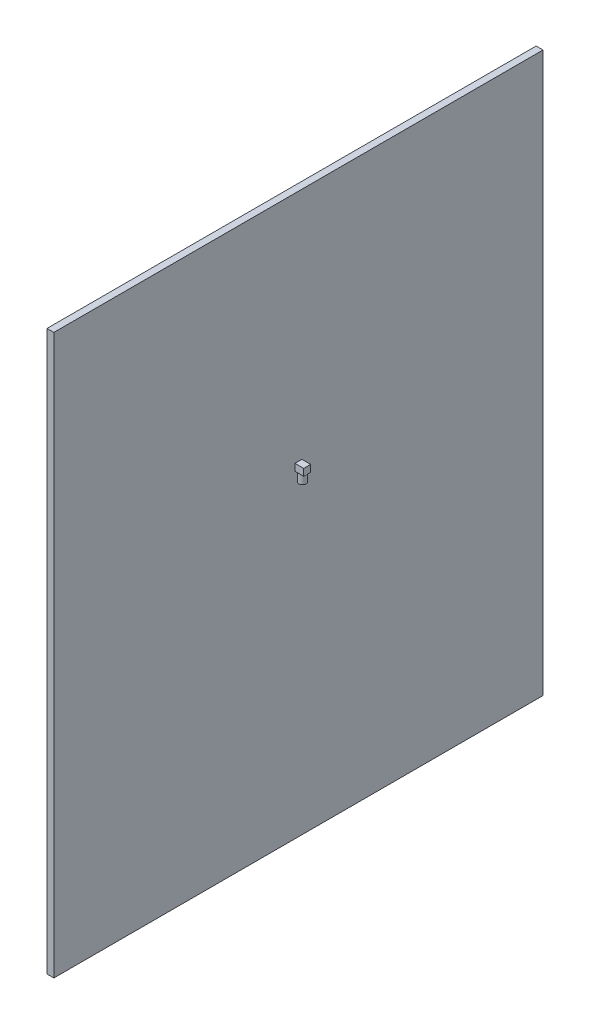
ISO-10303-21;
HEADER;
FILE_DESCRIPTION(('STEP AP214'),'2;1');
FILE_NAME('part.step','',(''),(''),'','','');
FILE_SCHEMA(('AUTOMOTIVE_DESIGN { 1 0 10303 214 1 1 1 1 }'));
ENDSEC;
DATA;
#1=APPLICATION_CONTEXT('core data for automotive mechanical design processes');
#2=APPLICATION_PROTOCOL_DEFINITION('international standard','automotive_design',2000,#1);
#3=PRODUCT_CONTEXT('',#1,'mechanical');
#4=PRODUCT('Part','Part','',(#3));
#5=PRODUCT_RELATED_PRODUCT_CATEGORY('part','',(#4));
#6=PRODUCT_DEFINITION_FORMATION('','',#4);
#7=PRODUCT_DEFINITION_CONTEXT('part definition',#1,'design');
#8=PRODUCT_DEFINITION('design','',#6,#7);
#9=PRODUCT_DEFINITION_SHAPE('','',#8);
#10=(LENGTH_UNIT() NAMED_UNIT(*) SI_UNIT(.MILLI.,.METRE.));
#11=(NAMED_UNIT(*) PLANE_ANGLE_UNIT() SI_UNIT($,.RADIAN.));
#12=(NAMED_UNIT(*) SI_UNIT($,.STERADIAN.) SOLID_ANGLE_UNIT());
#13=UNCERTAINTY_MEASURE_WITH_UNIT(LENGTH_MEASURE(1.E-05),#10,'distance_accuracy_value','');
#14=(GEOMETRIC_REPRESENTATION_CONTEXT(3) GLOBAL_UNCERTAINTY_ASSIGNED_CONTEXT((#13)) GLOBAL_UNIT_ASSIGNED_CONTEXT((#10,
#11,#12)) REPRESENTATION_CONTEXT('',''));
#15=CARTESIAN_POINT('',(0.,0.,0.));
#16=DIRECTION('',(0.,0.,1.));
#17=DIRECTION('',(1.,0.,0.));
#18=AXIS2_PLACEMENT_3D('',#15,#16,#17);
#19=CARTESIAN_POINT('',(22.7,56.3,5.00000000000002));
#20=DIRECTION('',(0.,1.,0.));
#21=DIRECTION('',(0.,0.,1.));
#22=AXIS2_PLACEMENT_3D('',#19,#20,#21);
#23=PLANE('',#22);
#24=CARTESIAN_POINT('',(16.,56.3,0.));
#25=DIRECTION('',(0.,1.,0.));
#26=DIRECTION('',(0.,0.,1.));
#27=AXIS2_PLACEMENT_3D('',#24,#25,#26);
#28=CIRCLE('',#27,5.335);
#29=CARTESIAN_POINT('',(14.1392944886415,56.3,5.00000000000002));
#30=VERTEX_POINT('',#29);
#31=CARTESIAN_POINT('',(14.1392944886414,56.3,-4.99999999999998));
#32=VERTEX_POINT('',#31);
#33=EDGE_CURVE('E11',#30,#32,#28,.F.);
#34=ORIENTED_EDGE('',*,*,#33,.F.);
#35=DIRECTION('',(-1.,0.,0.));
#36=VECTOR('',#35,1.);
#37=CARTESIAN_POINT('',(22.7,56.3,5.00000000000002));
#38=LINE('',#37,#36);
#39=CARTESIAN_POINT('',(10.,56.3,5.00000000000002));
#40=VERTEX_POINT('',#39);
#41=EDGE_CURVE('E134',#30,#40,#38,.T.);
#42=ORIENTED_EDGE('',*,*,#41,.T.);
#43=DIRECTION('',(0.,0.,-1.));
#44=VECTOR('',#43,1.);
#45=CARTESIAN_POINT('',(10.,56.3,5.00000000000002));
#46=LINE('',#45,#44);
#47=CARTESIAN_POINT('',(10.,56.3,-4.99999999999998));
#48=VERTEX_POINT('',#47);
#49=EDGE_CURVE('E164',#40,#48,#46,.T.);
#50=ORIENTED_EDGE('',*,*,#49,.T.);
#51=DIRECTION('',(-1.,0.,0.));
#52=VECTOR('',#51,1.);
#53=CARTESIAN_POINT('',(22.7,56.3,-4.99999999999998));
#54=LINE('',#53,#52);
#55=EDGE_CURVE('E64',#32,#48,#54,.T.);
#56=ORIENTED_EDGE('',*,*,#55,.F.);
#57=EDGE_LOOP('',(#34,#42,#50,#56));
#58=FACE_BOUND('',#57,.T.);
#59=ADVANCED_FACE('F45',(#58),#23,.F.);
#60=CARTESIAN_POINT('',(10.,0.,0.));
#61=DIRECTION('',(1.,0.,0.));
#62=DIRECTION('',(0.,0.,-1.));
#63=AXIS2_PLACEMENT_3D('',#60,#61,#62);
#64=PLANE('',#63);
#65=DIRECTION('',(0.,1.,0.));
#66=VECTOR('',#65,1.);
#67=CARTESIAN_POINT('',(10.,406.4,-355.6));
#68=LINE('',#67,#66);
#69=CARTESIAN_POINT('',(10.,-406.4,-355.6));
#70=VERTEX_POINT('',#69);
#71=CARTESIAN_POINT('',(10.,406.4,-355.6));
#72=VERTEX_POINT('',#71);
#73=EDGE_CURVE('E194',#70,#72,#68,.T.);
#74=ORIENTED_EDGE('',*,*,#73,.T.);
#75=DIRECTION('',(0.,0.,1.));
#76=VECTOR('',#75,1.);
#77=CARTESIAN_POINT('',(10.,406.4,355.6));
#78=LINE('',#77,#76);
#79=CARTESIAN_POINT('',(10.,406.4,355.6));
#80=VERTEX_POINT('',#79);
#81=EDGE_CURVE('E198',#72,#80,#78,.T.);
#82=ORIENTED_EDGE('',*,*,#81,.T.);
#83=DIRECTION('',(0.,-1.,0.));
#84=VECTOR('',#83,1.);
#85=CARTESIAN_POINT('',(10.,406.4,355.6));
#86=LINE('',#85,#84);
#87=CARTESIAN_POINT('',(10.,-406.4,355.6));
#88=VERTEX_POINT('',#87);
#89=EDGE_CURVE('E202',#80,#88,#86,.T.);
#90=ORIENTED_EDGE('',*,*,#89,.T.);
#91=DIRECTION('',(0.,0.,-1.));
#92=VECTOR('',#91,1.);
#93=CARTESIAN_POINT('',(10.,-406.4,355.6));
#94=LINE('',#93,#92);
#95=EDGE_CURVE('E205',#88,#70,#94,.T.);
#96=ORIENTED_EDGE('',*,*,#95,.T.);
#97=EDGE_LOOP('',(#74,#82,#90,#96));
#98=FACE_BOUND('',#97,.T.);
#99=DIRECTION('',(0.,0.,1.));
#100=VECTOR('',#99,1.);
#101=CARTESIAN_POINT('',(10.,66.3,5.00000000000002));
#102=LINE('',#101,#100);
#103=CARTESIAN_POINT('',(10.,66.3,-4.99999999999998));
#104=VERTEX_POINT('',#103);
#105=CARTESIAN_POINT('',(10.,66.3,5.00000000000002));
#106=VERTEX_POINT('',#105);
#107=EDGE_CURVE('E175',#104,#106,#102,.T.);
#108=ORIENTED_EDGE('',*,*,#107,.F.);
#109=DIRECTION('',(0.,1.,0.));
#110=VECTOR('',#109,1.);
#111=CARTESIAN_POINT('',(10.,66.3,-4.99999999999998));
#112=LINE('',#111,#110);
#113=EDGE_CURVE('E155',#48,#104,#112,.T.);
#114=ORIENTED_EDGE('',*,*,#113,.F.);
#115=ORIENTED_EDGE('',*,*,#49,.F.);
#116=DIRECTION('',(0.,-1.,0.));
#117=VECTOR('',#116,1.);
#118=CARTESIAN_POINT('',(10.,66.3,5.00000000000002));
#119=LINE('',#118,#117);
#120=EDGE_CURVE('E178',#106,#40,#119,.T.);
#121=ORIENTED_EDGE('',*,*,#120,.F.);
#122=EDGE_LOOP('',(#108,#114,#115,#121));
#123=FACE_BOUND('',#122,.T.);
#124=ADVANCED_FACE('F252',(#98,#123),#64,.T.);
#125=CARTESIAN_POINT('',(10.,406.4,-355.6));
#126=DIRECTION('',(0.,0.,1.));
#127=DIRECTION('',(0.,-1.,0.));
#128=AXIS2_PLACEMENT_3D('',#125,#126,#127);
#129=PLANE('',#128);
#130=DIRECTION('',(0.,1.,0.));
#131=VECTOR('',#130,1.);
#132=CARTESIAN_POINT('',(0.,406.4,-355.6));
#133=LINE('',#132,#131);
#134=CARTESIAN_POINT('',(0.,-406.4,-355.6));
#135=VERTEX_POINT('',#134);
#136=CARTESIAN_POINT('',(0.,406.4,-355.6));
#137=VERTEX_POINT('',#136);
#138=EDGE_CURVE('E193',#135,#137,#133,.T.);
#139=ORIENTED_EDGE('',*,*,#138,.T.);
#140=DIRECTION('',(-1.,0.,0.));
#141=VECTOR('',#140,1.);
#142=CARTESIAN_POINT('',(10.,406.4,-355.6));
#143=LINE('',#142,#141);
#144=EDGE_CURVE('E54',#72,#137,#143,.T.);
#145=ORIENTED_EDGE('',*,*,#144,.F.);
#146=ORIENTED_EDGE('',*,*,#73,.F.);
#147=DIRECTION('',(-1.,0.,0.));
#148=VECTOR('',#147,1.);
#149=CARTESIAN_POINT('',(10.,-406.4,-355.6));
#150=LINE('',#149,#148);
#151=EDGE_CURVE('E208',#70,#135,#150,.T.);
#152=ORIENTED_EDGE('',*,*,#151,.T.);
#153=EDGE_LOOP('',(#139,#145,#146,#152));
#154=FACE_BOUND('',#153,.T.);
#155=ADVANCED_FACE('F47',(#154),#129,.F.);
#156=CARTESIAN_POINT('',(10.,406.4,355.6));
#157=DIRECTION('',(0.,-1.,0.));
#158=DIRECTION('',(0.,0.,-1.));
#159=AXIS2_PLACEMENT_3D('',#156,#157,#158);
#160=PLANE('',#159);
#161=DIRECTION('',(0.,0.,1.));
#162=VECTOR('',#161,1.);
#163=CARTESIAN_POINT('',(0.,406.4,355.6));
#164=LINE('',#163,#162);
#165=CARTESIAN_POINT('',(0.,406.4,355.6));
#166=VERTEX_POINT('',#165);
#167=EDGE_CURVE('E212',#137,#166,#164,.T.);
#168=ORIENTED_EDGE('',*,*,#167,.T.);
#169=DIRECTION('',(-1.,0.,0.));
#170=VECTOR('',#169,1.);
#171=CARTESIAN_POINT('',(10.,406.4,355.6));
#172=LINE('',#171,#170);
#173=EDGE_CURVE('E227',#80,#166,#172,.T.);
#174=ORIENTED_EDGE('',*,*,#173,.F.);
#175=ORIENTED_EDGE('',*,*,#81,.F.);
#176=ORIENTED_EDGE('',*,*,#144,.T.);
#177=EDGE_LOOP('',(#168,#174,#175,#176));
#178=FACE_BOUND('',#177,.T.);
#179=ADVANCED_FACE('F234',(#178),#160,.F.);
#180=CARTESIAN_POINT('',(10.,406.4,355.6));
#181=DIRECTION('',(0.,0.,-1.));
#182=DIRECTION('',(0.,1.,0.));
#183=AXIS2_PLACEMENT_3D('',#180,#181,#182);
#184=PLANE('',#183);
#185=DIRECTION('',(0.,-1.,0.));
#186=VECTOR('',#185,1.);
#187=CARTESIAN_POINT('',(0.,406.4,355.6));
#188=LINE('',#187,#186);
#189=CARTESIAN_POINT('',(0.,-406.4,355.6));
#190=VERTEX_POINT('',#189);
#191=EDGE_CURVE('E215',#166,#190,#188,.T.);
#192=ORIENTED_EDGE('',*,*,#191,.T.);
#193=DIRECTION('',(-1.,0.,0.));
#194=VECTOR('',#193,1.);
#195=CARTESIAN_POINT('',(10.,-406.4,355.6));
#196=LINE('',#195,#194);
#197=EDGE_CURVE('E223',#88,#190,#196,.T.);
#198=ORIENTED_EDGE('',*,*,#197,.F.);
#199=ORIENTED_EDGE('',*,*,#89,.F.);
#200=ORIENTED_EDGE('',*,*,#173,.T.);
#201=EDGE_LOOP('',(#192,#198,#199,#200));
#202=FACE_BOUND('',#201,.T.);
#203=ADVANCED_FACE('F246',(#202),#184,.F.);
#204=CARTESIAN_POINT('',(10.,-406.4,355.6));
#205=DIRECTION('',(0.,1.,0.));
#206=DIRECTION('',(0.,0.,1.));
#207=AXIS2_PLACEMENT_3D('',#204,#205,#206);
#208=PLANE('',#207);
#209=DIRECTION('',(0.,0.,-1.));
#210=VECTOR('',#209,1.);
#211=CARTESIAN_POINT('',(0.,-406.4,355.6));
#212=LINE('',#211,#210);
#213=EDGE_CURVE('E199',#190,#135,#212,.T.);
#214=ORIENTED_EDGE('',*,*,#213,.T.);
#215=ORIENTED_EDGE('',*,*,#151,.F.);
#216=ORIENTED_EDGE('',*,*,#95,.F.);
#217=ORIENTED_EDGE('',*,*,#197,.T.);
#218=EDGE_LOOP('',(#214,#215,#216,#217));
#219=FACE_BOUND('',#218,.T.);
#220=ADVANCED_FACE('F250',(#219),#208,.F.);
#221=CARTESIAN_POINT('',(0.,0.,0.));
#222=DIRECTION('',(1.,0.,0.));
#223=DIRECTION('',(0.,0.,-1.));
#224=AXIS2_PLACEMENT_3D('',#221,#222,#223);
#225=PLANE('',#224);
#226=ORIENTED_EDGE('',*,*,#138,.F.);
#227=ORIENTED_EDGE('',*,*,#213,.F.);
#228=ORIENTED_EDGE('',*,*,#191,.F.);
#229=ORIENTED_EDGE('',*,*,#167,.F.);
#230=EDGE_LOOP('',(#226,#227,#228,#229));
#231=FACE_BOUND('',#230,.T.);
#232=ADVANCED_FACE('F242',(#231),#225,.F.);
#233=CARTESIAN_POINT('',(22.7,66.3,-4.99999999999998));
#234=DIRECTION('',(0.,0.,1.));
#235=DIRECTION('',(0.,-1.,0.));
#236=AXIS2_PLACEMENT_3D('',#233,#234,#235);
#237=PLANE('',#236);
#238=ORIENTED_EDGE('',*,*,#113,.T.);
#239=DIRECTION('',(-1.,0.,0.));
#240=VECTOR('',#239,1.);
#241=CARTESIAN_POINT('',(22.7,66.3,-4.99999999999998));
#242=LINE('',#241,#240);
#243=CARTESIAN_POINT('',(22.7,66.3,-4.99999999999998));
#244=VERTEX_POINT('',#243);
#245=EDGE_CURVE('E190',#244,#104,#242,.T.);
#246=ORIENTED_EDGE('',*,*,#245,.F.);
#247=DIRECTION('',(0.,1.,0.));
#248=VECTOR('',#247,1.);
#249=CARTESIAN_POINT('',(22.7,66.3,-4.99999999999998));
#250=LINE('',#249,#248);
#251=CARTESIAN_POINT('',(22.7,56.3,-4.99999999999998));
#252=VERTEX_POINT('',#251);
#253=EDGE_CURVE('E159',#252,#244,#250,.T.);
#254=ORIENTED_EDGE('',*,*,#253,.F.);
#255=CARTESIAN_POINT('',(17.8607055113586,56.3,-4.99999999999998));
#256=VERTEX_POINT('',#255);
#257=EDGE_CURVE('E183',#252,#256,#54,.T.);
#258=ORIENTED_EDGE('',*,*,#257,.T.);
#259=EDGE_CURVE('E185',#256,#32,#54,.T.);
#260=ORIENTED_EDGE('',*,*,#259,.T.);
#261=ORIENTED_EDGE('',*,*,#55,.T.);
#262=EDGE_LOOP('',(#238,#246,#254,#258,#260,#261));
#263=FACE_BOUND('',#262,.T.);
#264=ADVANCED_FACE('F268',(#263),#237,.F.);
#265=CARTESIAN_POINT('',(22.7,66.3,5.00000000000002));
#266=DIRECTION('',(0.,-1.,0.));
#267=DIRECTION('',(0.,0.,-1.));
#268=AXIS2_PLACEMENT_3D('',#265,#266,#267);
#269=PLANE('',#268);
#270=ORIENTED_EDGE('',*,*,#107,.T.);
#271=DIRECTION('',(-1.,0.,0.));
#272=VECTOR('',#271,1.);
#273=CARTESIAN_POINT('',(22.7,66.3,5.00000000000002));
#274=LINE('',#273,#272);
#275=CARTESIAN_POINT('',(22.7,66.3,5.00000000000002));
#276=VERTEX_POINT('',#275);
#277=EDGE_CURVE('E131',#276,#106,#274,.T.);
#278=ORIENTED_EDGE('',*,*,#277,.F.);
#279=DIRECTION('',(0.,0.,1.));
#280=VECTOR('',#279,1.);
#281=CARTESIAN_POINT('',(22.7,66.3,5.00000000000002));
#282=LINE('',#281,#280);
#283=EDGE_CURVE('E163',#244,#276,#282,.T.);
#284=ORIENTED_EDGE('',*,*,#283,.F.);
#285=ORIENTED_EDGE('',*,*,#245,.T.);
#286=EDGE_LOOP('',(#270,#278,#284,#285));
#287=FACE_BOUND('',#286,.T.);
#288=ADVANCED_FACE('F262',(#287),#269,.F.);
#289=CARTESIAN_POINT('',(22.7,66.3,5.00000000000002));
#290=DIRECTION('',(0.,0.,-1.));
#291=DIRECTION('',(0.,1.,0.));
#292=AXIS2_PLACEMENT_3D('',#289,#290,#291);
#293=PLANE('',#292);
#294=ORIENTED_EDGE('',*,*,#120,.T.);
#295=ORIENTED_EDGE('',*,*,#41,.F.);
#296=CARTESIAN_POINT('',(17.8607055113585,56.3,5.00000000000002));
#297=VERTEX_POINT('',#296);
#298=EDGE_CURVE('E132',#297,#30,#38,.T.);
#299=ORIENTED_EDGE('',*,*,#298,.F.);
#300=CARTESIAN_POINT('',(22.7,56.3,5.00000000000002));
#301=VERTEX_POINT('',#300);
#302=EDGE_CURVE('E120',#301,#297,#38,.T.);
#303=ORIENTED_EDGE('',*,*,#302,.F.);
#304=DIRECTION('',(0.,-1.,0.));
#305=VECTOR('',#304,1.);
#306=CARTESIAN_POINT('',(22.7,66.3,5.00000000000002));
#307=LINE('',#306,#305);
#308=EDGE_CURVE('E167',#276,#301,#307,.T.);
#309=ORIENTED_EDGE('',*,*,#308,.F.);
#310=ORIENTED_EDGE('',*,*,#277,.T.);
#311=EDGE_LOOP('',(#294,#295,#299,#303,#309,#310));
#312=FACE_BOUND('',#311,.T.);
#313=ADVANCED_FACE('F138',(#312),#293,.F.);
#314=CARTESIAN_POINT('',(16.,56.3,0.));
#315=DIRECTION('',(0.,-1.,0.));
#316=DIRECTION('',(0.,0.,-1.));
#317=AXIS2_PLACEMENT_3D('',#314,#315,#316);
#318=CIRCLE('',#317,5.335);
#319=EDGE_CURVE('E125',#256,#297,#318,.T.);
#320=ORIENTED_EDGE('',*,*,#319,.F.);
#321=ORIENTED_EDGE('',*,*,#257,.F.);
#322=DIRECTION('',(0.,0.,-1.));
#323=VECTOR('',#322,1.);
#324=CARTESIAN_POINT('',(22.7,56.3,5.00000000000002));
#325=LINE('',#324,#323);
#326=EDGE_CURVE('E127',#301,#252,#325,.T.);
#327=ORIENTED_EDGE('',*,*,#326,.F.);
#328=ORIENTED_EDGE('',*,*,#302,.T.);
#329=EDGE_LOOP('',(#320,#321,#327,#328));
#330=FACE_BOUND('',#329,.T.);
#331=ADVANCED_FACE('F122',(#330),#23,.F.);
#332=CARTESIAN_POINT('',(22.7,0.,0.));
#333=DIRECTION('',(1.,0.,0.));
#334=DIRECTION('',(0.,0.,-1.));
#335=AXIS2_PLACEMENT_3D('',#332,#333,#334);
#336=PLANE('',#335);
#337=ORIENTED_EDGE('',*,*,#253,.T.);
#338=ORIENTED_EDGE('',*,*,#283,.T.);
#339=ORIENTED_EDGE('',*,*,#308,.T.);
#340=ORIENTED_EDGE('',*,*,#326,.T.);
#341=EDGE_LOOP('',(#337,#338,#339,#340));
#342=FACE_BOUND('',#341,.T.);
#343=ADVANCED_FACE('F265',(#342),#336,.T.);
#344=CARTESIAN_POINT('',(16.,56.3,0.));
#345=DIRECTION('',(0.,-1.,0.));
#346=DIRECTION('',(0.,0.,-1.));
#347=AXIS2_PLACEMENT_3D('',#344,#345,#346);
#348=PLANE('',#347);
#349=EDGE_CURVE('E146',#32,#256,#318,.T.);
#350=ORIENTED_EDGE('',*,*,#349,.F.);
#351=ORIENTED_EDGE('',*,*,#259,.F.);
#352=EDGE_LOOP('',(#350,#351));
#353=FACE_BOUND('',#352,.T.);
#354=ADVANCED_FACE('F286',(#353),#348,.F.);
#355=EDGE_CURVE('E142',#297,#30,#318,.T.);
#356=ORIENTED_EDGE('',*,*,#355,.F.);
#357=ORIENTED_EDGE('',*,*,#298,.T.);
#358=EDGE_LOOP('',(#356,#357));
#359=FACE_BOUND('',#358,.T.);
#360=ADVANCED_FACE('F143',(#359),#348,.F.);
#361=CARTESIAN_POINT('',(16.,43.6,0.));
#362=DIRECTION('',(0.,1.,0.));
#363=DIRECTION('',(0.,0.,1.));
#364=AXIS2_PLACEMENT_3D('',#361,#362,#363);
#365=CYLINDRICAL_SURFACE('',#364,5.335);
#366=CARTESIAN_POINT('',(16.,43.6,0.));
#367=DIRECTION('',(0.,-1.,0.));
#368=DIRECTION('',(0.,0.,-1.));
#369=AXIS2_PLACEMENT_3D('',#366,#367,#368);
#370=CIRCLE('',#369,5.335);
#371=CARTESIAN_POINT('',(16.,43.6,-5.335));
#372=VERTEX_POINT('',#371);
#373=EDGE_CURVE('E152',#372,#372,#370,.T.);
#374=ORIENTED_EDGE('',*,*,#373,.F.);
#375=EDGE_LOOP('',(#374));
#376=FACE_BOUND('',#375,.T.);
#377=ORIENTED_EDGE('',*,*,#319,.T.);
#378=ORIENTED_EDGE('',*,*,#355,.T.);
#379=ORIENTED_EDGE('',*,*,#33,.T.);
#380=ORIENTED_EDGE('',*,*,#349,.T.);
#381=EDGE_LOOP('',(#377,#378,#379,#380));
#382=FACE_BOUND('',#381,.T.);
#383=ADVANCED_FACE('F149',(#376,#382),#365,.T.);
#384=CARTESIAN_POINT('',(16.,43.6,0.));
#385=DIRECTION('',(0.,-1.,0.));
#386=DIRECTION('',(0.,0.,-1.));
#387=AXIS2_PLACEMENT_3D('',#384,#385,#386);
#388=PLANE('',#387);
#389=ORIENTED_EDGE('',*,*,#373,.T.);
#390=EDGE_LOOP('',(#389));
#391=FACE_BOUND('',#390,.T.);
#392=ADVANCED_FACE('F386',(#391),#388,.T.);
#393=CLOSED_SHELL('',(#59,#124,#155,#179,#203,#220,#232,#264,#288,#313,#331,#343,#354,#360,#383,#392));
#394=MANIFOLD_SOLID_BREP('B2',#393);
#395=ADVANCED_BREP_SHAPE_REPRESENTATION('',(#18,#394),#14);
#396=SHAPE_DEFINITION_REPRESENTATION(#9,#395);
ENDSEC;
END-ISO-10303-21;
